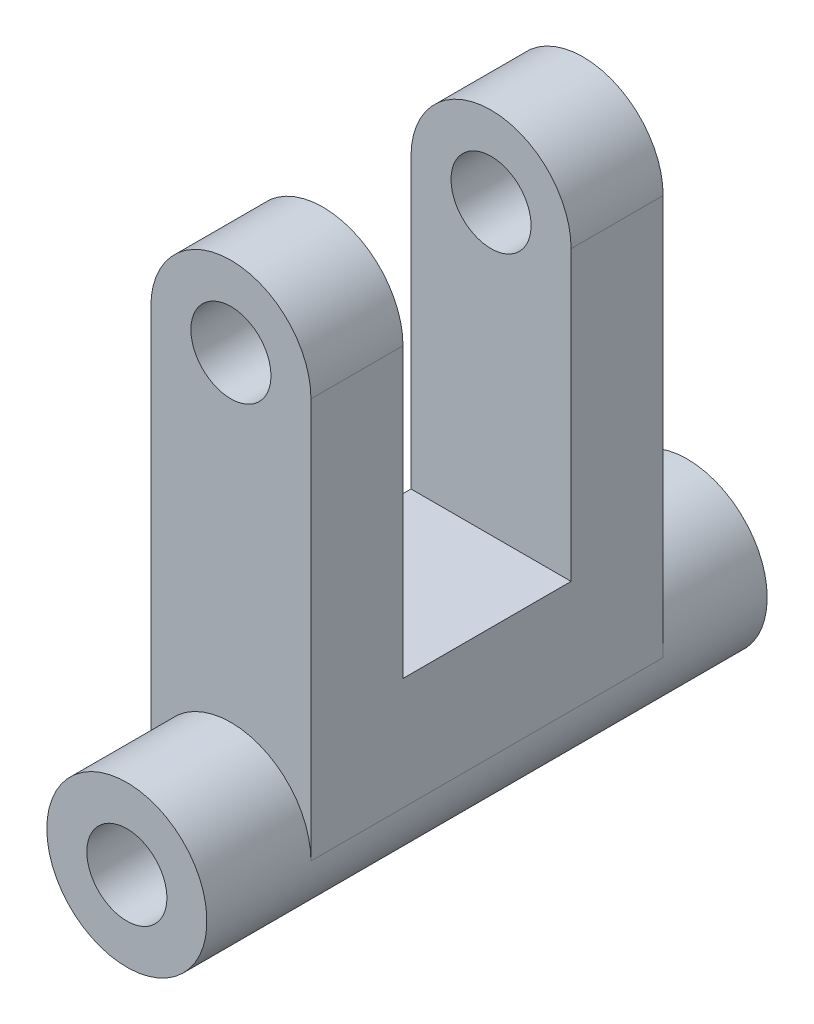
ISO-10303-21;
HEADER;
FILE_DESCRIPTION(('STEP AP214'),'2;1');
FILE_NAME('part.step','',(''),(''),'','','');
FILE_SCHEMA(('AUTOMOTIVE_DESIGN { 1 0 10303 214 1 1 1 1 }'));
ENDSEC;
DATA;
#1=APPLICATION_CONTEXT('core data for automotive mechanical design processes');
#2=APPLICATION_PROTOCOL_DEFINITION('international standard','automotive_design',2000,#1);
#3=PRODUCT_CONTEXT('',#1,'mechanical');
#4=PRODUCT('Part','Part','',(#3));
#5=PRODUCT_RELATED_PRODUCT_CATEGORY('part','',(#4));
#6=PRODUCT_DEFINITION_FORMATION('','',#4);
#7=PRODUCT_DEFINITION_CONTEXT('part definition',#1,'design');
#8=PRODUCT_DEFINITION('design','',#6,#7);
#9=PRODUCT_DEFINITION_SHAPE('','',#8);
#10=(LENGTH_UNIT() NAMED_UNIT(*) SI_UNIT(.MILLI.,.METRE.));
#11=(NAMED_UNIT(*) PLANE_ANGLE_UNIT() SI_UNIT($,.RADIAN.));
#12=(NAMED_UNIT(*) SI_UNIT($,.STERADIAN.) SOLID_ANGLE_UNIT());
#13=UNCERTAINTY_MEASURE_WITH_UNIT(LENGTH_MEASURE(1.E-05),#10,'distance_accuracy_value','');
#14=(GEOMETRIC_REPRESENTATION_CONTEXT(3) GLOBAL_UNCERTAINTY_ASSIGNED_CONTEXT((#13)) GLOBAL_UNIT_ASSIGNED_CONTEXT((#10,
#11,#12)) REPRESENTATION_CONTEXT('',''));
#15=CARTESIAN_POINT('',(0.,0.,0.));
#16=DIRECTION('',(0.,0.,1.));
#17=DIRECTION('',(1.,0.,0.));
#18=AXIS2_PLACEMENT_3D('',#15,#16,#17);
#19=CARTESIAN_POINT('',(0.,0.,5.75));
#20=DIRECTION('',(0.,0.,-1.));
#21=DIRECTION('',(-1.,0.,0.));
#22=AXIS2_PLACEMENT_3D('',#19,#20,#21);
#23=CYLINDRICAL_SURFACE('',#22,5.);
#24=CARTESIAN_POINT('',(0.,0.,-6.5));
#25=DIRECTION('',(0.,0.,1.));
#26=DIRECTION('',(1.,0.,0.));
#27=AXIS2_PLACEMENT_3D('',#24,#25,#26);
#28=CIRCLE('',#27,5.);
#29=CARTESIAN_POINT('',(5.,0.,-6.5));
#30=VERTEX_POINT('',#29);
#31=EDGE_CURVE('E185',#30,#30,#28,.T.);
#32=ORIENTED_EDGE('',*,*,#31,.T.);
#33=EDGE_LOOP('',(#32));
#34=FACE_BOUND('',#33,.T.);
#35=DIRECTION('',(0.,0.,-1.));
#36=VECTOR('',#35,1.);
#37=CARTESIAN_POINT('',(-5.,0.,5.75));
#38=LINE('',#37,#36);
#39=CARTESIAN_POINT('',(-5.,0.,22.));
#40=VERTEX_POINT('',#39);
#41=CARTESIAN_POINT('',(-5.,0.,0.));
#42=VERTEX_POINT('',#41);
#43=EDGE_CURVE('E168',#40,#42,#38,.T.);
#44=ORIENTED_EDGE('',*,*,#43,.T.);
#45=CARTESIAN_POINT('',(0.,0.,0.));
#46=DIRECTION('',(0.,0.,-1.));
#47=DIRECTION('',(-1.,0.,0.));
#48=AXIS2_PLACEMENT_3D('',#45,#46,#47);
#49=CIRCLE('',#48,5.);
#50=CARTESIAN_POINT('',(5.,0.,0.));
#51=VERTEX_POINT('',#50);
#52=EDGE_CURVE('E65',#42,#51,#49,.T.);
#53=ORIENTED_EDGE('',*,*,#52,.T.);
#54=DIRECTION('',(0.,0.,-1.));
#55=VECTOR('',#54,1.);
#56=CARTESIAN_POINT('',(5.,0.,5.75));
#57=LINE('',#56,#55);
#58=CARTESIAN_POINT('',(5.,0.,22.));
#59=VERTEX_POINT('',#58);
#60=EDGE_CURVE('E166',#59,#51,#57,.T.);
#61=ORIENTED_EDGE('',*,*,#60,.F.);
#62=CARTESIAN_POINT('',(0.,0.,22.));
#63=DIRECTION('',(0.,0.,1.));
#64=DIRECTION('',(1.,0.,0.));
#65=AXIS2_PLACEMENT_3D('',#62,#63,#64);
#66=CIRCLE('',#65,5.);
#67=EDGE_CURVE('E145',#59,#40,#66,.T.);
#68=ORIENTED_EDGE('',*,*,#67,.T.);
#69=EDGE_LOOP('',(#44,#53,#61,#68));
#70=FACE_BOUND('',#69,.T.);
#71=CARTESIAN_POINT('',(0.,0.,28.5));
#72=DIRECTION('',(0.,0.,-1.));
#73=DIRECTION('',(-1.,0.,0.));
#74=AXIS2_PLACEMENT_3D('',#71,#72,#73);
#75=CIRCLE('',#74,5.);
#76=CARTESIAN_POINT('',(-5.,0.,28.5));
#77=VERTEX_POINT('',#76);
#78=EDGE_CURVE('E177',#77,#77,#75,.T.);
#79=ORIENTED_EDGE('',*,*,#78,.T.);
#80=EDGE_LOOP('',(#79));
#81=FACE_BOUND('',#80,.T.);
#82=ADVANCED_FACE('F40',(#34,#70,#81),#23,.T.);
#83=CARTESIAN_POINT('',(5.,0.,5.75));
#84=DIRECTION('',(1.,0.,0.));
#85=DIRECTION('',(0.,1.,0.));
#86=AXIS2_PLACEMENT_3D('',#83,#84,#85);
#87=PLANE('',#86);
#88=DIRECTION('',(0.,0.,-1.));
#89=VECTOR('',#88,1.);
#90=CARTESIAN_POINT('',(5.,7.,5.75));
#91=LINE('',#90,#89);
#92=CARTESIAN_POINT('',(5.,7.,16.25));
#93=VERTEX_POINT('',#92);
#94=CARTESIAN_POINT('',(5.,7.,5.75));
#95=VERTEX_POINT('',#94);
#96=EDGE_CURVE('E116',#93,#95,#91,.T.);
#97=ORIENTED_EDGE('',*,*,#96,.F.);
#98=DIRECTION('',(0.,1.,0.));
#99=VECTOR('',#98,1.);
#100=CARTESIAN_POINT('',(5.,0.,16.25));
#101=LINE('',#100,#99);
#102=CARTESIAN_POINT('',(5.,25.,16.25));
#103=VERTEX_POINT('',#102);
#104=EDGE_CURVE('E141',#93,#103,#101,.T.);
#105=ORIENTED_EDGE('',*,*,#104,.T.);
#106=DIRECTION('',(0.,0.,-1.));
#107=VECTOR('',#106,1.);
#108=CARTESIAN_POINT('',(5.,25.,5.75));
#109=LINE('',#108,#107);
#110=CARTESIAN_POINT('',(5.,25.,22.));
#111=VERTEX_POINT('',#110);
#112=EDGE_CURVE('E123',#111,#103,#109,.T.);
#113=ORIENTED_EDGE('',*,*,#112,.F.);
#114=DIRECTION('',(0.,1.,0.));
#115=VECTOR('',#114,1.);
#116=CARTESIAN_POINT('',(5.,0.,22.));
#117=LINE('',#116,#115);
#118=EDGE_CURVE('E148',#59,#111,#117,.T.);
#119=ORIENTED_EDGE('',*,*,#118,.F.);
#120=ORIENTED_EDGE('',*,*,#60,.T.);
#121=DIRECTION('',(0.,-1.,0.));
#122=VECTOR('',#121,1.);
#123=CARTESIAN_POINT('',(5.,0.,0.));
#124=LINE('',#123,#122);
#125=CARTESIAN_POINT('',(5.,25.,0.));
#126=VERTEX_POINT('',#125);
#127=EDGE_CURVE('E157',#126,#51,#124,.T.);
#128=ORIENTED_EDGE('',*,*,#127,.F.);
#129=CARTESIAN_POINT('',(5.,25.,5.75));
#130=VERTEX_POINT('',#129);
#131=EDGE_CURVE('E173',#130,#126,#109,.T.);
#132=ORIENTED_EDGE('',*,*,#131,.F.);
#133=DIRECTION('',(0.,1.,0.));
#134=VECTOR('',#133,1.);
#135=CARTESIAN_POINT('',(5.,0.,5.75));
#136=LINE('',#135,#134);
#137=EDGE_CURVE('E136',#95,#130,#136,.T.);
#138=ORIENTED_EDGE('',*,*,#137,.F.);
#139=EDGE_LOOP('',(#97,#105,#113,#119,#120,#128,#132,#138));
#140=FACE_BOUND('',#139,.T.);
#141=ADVANCED_FACE('F42',(#140),#87,.T.);
#142=CARTESIAN_POINT('',(0.,25.,5.75));
#143=DIRECTION('',(0.,0.,-1.));
#144=DIRECTION('',(-1.,0.,0.));
#145=AXIS2_PLACEMENT_3D('',#142,#143,#144);
#146=CYLINDRICAL_SURFACE('',#145,5.);
#147=CARTESIAN_POINT('',(0.,25.,16.25));
#148=DIRECTION('',(0.,0.,-1.));
#149=DIRECTION('',(0.,1.,0.));
#150=AXIS2_PLACEMENT_3D('',#147,#148,#149);
#151=CIRCLE('',#150,5.);
#152=CARTESIAN_POINT('',(-5.,25.,16.25));
#153=VERTEX_POINT('',#152);
#154=EDGE_CURVE('E139',#153,#103,#151,.T.);
#155=ORIENTED_EDGE('',*,*,#154,.F.);
#156=DIRECTION('',(0.,0.,-1.));
#157=VECTOR('',#156,1.);
#158=CARTESIAN_POINT('',(-5.,25.,5.75));
#159=LINE('',#158,#157);
#160=CARTESIAN_POINT('',(-5.,25.,22.));
#161=VERTEX_POINT('',#160);
#162=EDGE_CURVE('E171',#161,#153,#159,.T.);
#163=ORIENTED_EDGE('',*,*,#162,.F.);
#164=CARTESIAN_POINT('',(0.,25.,22.));
#165=DIRECTION('',(0.,0.,1.));
#166=DIRECTION('',(1.,0.,0.));
#167=AXIS2_PLACEMENT_3D('',#164,#165,#166);
#168=CIRCLE('',#167,5.);
#169=EDGE_CURVE('E151',#111,#161,#168,.T.);
#170=ORIENTED_EDGE('',*,*,#169,.F.);
#171=ORIENTED_EDGE('',*,*,#112,.T.);
#172=EDGE_LOOP('',(#155,#163,#170,#171));
#173=FACE_BOUND('',#172,.T.);
#174=ADVANCED_FACE('F218',(#173),#146,.T.);
#175=CARTESIAN_POINT('',(0.,25.,5.75));
#176=DIRECTION('',(0.,0.,-1.));
#177=DIRECTION('',(0.,1.,0.));
#178=AXIS2_PLACEMENT_3D('',#175,#176,#177);
#179=CIRCLE('',#178,5.);
#180=CARTESIAN_POINT('',(-5.,25.,5.75));
#181=VERTEX_POINT('',#180);
#182=EDGE_CURVE('E57',#181,#130,#179,.T.);
#183=ORIENTED_EDGE('',*,*,#182,.T.);
#184=ORIENTED_EDGE('',*,*,#131,.T.);
#185=CARTESIAN_POINT('',(0.,25.,0.));
#186=DIRECTION('',(0.,0.,1.));
#187=DIRECTION('',(1.,0.,0.));
#188=AXIS2_PLACEMENT_3D('',#185,#186,#187);
#189=CIRCLE('',#188,5.);
#190=CARTESIAN_POINT('',(-5.,25.,0.));
#191=VERTEX_POINT('',#190);
#192=EDGE_CURVE('E160',#126,#191,#189,.T.);
#193=ORIENTED_EDGE('',*,*,#192,.T.);
#194=EDGE_CURVE('E170',#181,#191,#159,.T.);
#195=ORIENTED_EDGE('',*,*,#194,.F.);
#196=EDGE_LOOP('',(#183,#184,#193,#195));
#197=FACE_BOUND('',#196,.T.);
#198=ADVANCED_FACE('F225',(#197),#146,.T.);
#199=CARTESIAN_POINT('',(-5.,0.,5.75));
#200=DIRECTION('',(1.,0.,0.));
#201=DIRECTION('',(0.,1.,0.));
#202=AXIS2_PLACEMENT_3D('',#199,#200,#201);
#203=PLANE('',#202);
#204=DIRECTION('',(0.,1.,0.));
#205=VECTOR('',#204,1.);
#206=CARTESIAN_POINT('',(-5.,0.,16.25));
#207=LINE('',#206,#205);
#208=CARTESIAN_POINT('',(-5.,7.,16.25));
#209=VERTEX_POINT('',#208);
#210=EDGE_CURVE('E12',#209,#153,#207,.T.);
#211=ORIENTED_EDGE('',*,*,#210,.F.);
#212=DIRECTION('',(0.,0.,1.));
#213=VECTOR('',#212,1.);
#214=CARTESIAN_POINT('',(-5.,7.,0.));
#215=LINE('',#214,#213);
#216=CARTESIAN_POINT('',(-5.,7.,5.75));
#217=VERTEX_POINT('',#216);
#218=EDGE_CURVE('E113',#217,#209,#215,.T.);
#219=ORIENTED_EDGE('',*,*,#218,.F.);
#220=DIRECTION('',(0.,1.,0.));
#221=VECTOR('',#220,1.);
#222=CARTESIAN_POINT('',(-5.,0.,5.75));
#223=LINE('',#222,#221);
#224=EDGE_CURVE('E49',#217,#181,#223,.T.);
#225=ORIENTED_EDGE('',*,*,#224,.T.);
#226=ORIENTED_EDGE('',*,*,#194,.T.);
#227=DIRECTION('',(0.,-1.,0.));
#228=VECTOR('',#227,1.);
#229=CARTESIAN_POINT('',(-5.,0.,0.));
#230=LINE('',#229,#228);
#231=EDGE_CURVE('E163',#191,#42,#230,.T.);
#232=ORIENTED_EDGE('',*,*,#231,.T.);
#233=ORIENTED_EDGE('',*,*,#43,.F.);
#234=DIRECTION('',(0.,-1.,0.));
#235=VECTOR('',#234,1.);
#236=CARTESIAN_POINT('',(-5.,0.,22.));
#237=LINE('',#236,#235);
#238=EDGE_CURVE('E154',#161,#40,#237,.T.);
#239=ORIENTED_EDGE('',*,*,#238,.F.);
#240=ORIENTED_EDGE('',*,*,#162,.T.);
#241=EDGE_LOOP('',(#211,#219,#225,#226,#232,#233,#239,#240));
#242=FACE_BOUND('',#241,.T.);
#243=ADVANCED_FACE('F125',(#242),#203,.F.);
#244=CARTESIAN_POINT('',(0.,0.,0.));
#245=DIRECTION('',(0.,0.,1.));
#246=DIRECTION('',(1.,0.,0.));
#247=AXIS2_PLACEMENT_3D('',#244,#245,#246);
#248=PLANE('',#247);
#249=CARTESIAN_POINT('',(0.,25.,0.));
#250=DIRECTION('',(0.,0.,-1.));
#251=DIRECTION('',(-1.,0.,0.));
#252=AXIS2_PLACEMENT_3D('',#249,#250,#251);
#253=CIRCLE('',#252,2.5);
#254=CARTESIAN_POINT('',(-2.5,25.,0.));
#255=VERTEX_POINT('',#254);
#256=EDGE_CURVE('E189',#255,#255,#253,.T.);
#257=ORIENTED_EDGE('',*,*,#256,.F.);
#258=EDGE_LOOP('',(#257));
#259=FACE_BOUND('',#258,.T.);
#260=ORIENTED_EDGE('',*,*,#52,.F.);
#261=ORIENTED_EDGE('',*,*,#231,.F.);
#262=ORIENTED_EDGE('',*,*,#192,.F.);
#263=ORIENTED_EDGE('',*,*,#127,.T.);
#264=EDGE_LOOP('',(#260,#261,#262,#263));
#265=FACE_BOUND('',#264,.T.);
#266=ADVANCED_FACE('F222',(#259,#265),#248,.F.);
#267=CARTESIAN_POINT('',(0.,0.,22.));
#268=DIRECTION('',(0.,0.,1.));
#269=DIRECTION('',(1.,0.,0.));
#270=AXIS2_PLACEMENT_3D('',#267,#268,#269);
#271=PLANE('',#270);
#272=CARTESIAN_POINT('',(0.,25.,22.));
#273=DIRECTION('',(0.,0.,-1.));
#274=DIRECTION('',(-1.,0.,0.));
#275=AXIS2_PLACEMENT_3D('',#272,#273,#274);
#276=CIRCLE('',#275,2.5);
#277=CARTESIAN_POINT('',(-2.5,25.,22.));
#278=VERTEX_POINT('',#277);
#279=EDGE_CURVE('E190',#278,#278,#276,.T.);
#280=ORIENTED_EDGE('',*,*,#279,.T.);
#281=EDGE_LOOP('',(#280));
#282=FACE_BOUND('',#281,.T.);
#283=ORIENTED_EDGE('',*,*,#67,.F.);
#284=ORIENTED_EDGE('',*,*,#118,.T.);
#285=ORIENTED_EDGE('',*,*,#169,.T.);
#286=ORIENTED_EDGE('',*,*,#238,.T.);
#287=EDGE_LOOP('',(#283,#284,#285,#286));
#288=FACE_BOUND('',#287,.T.);
#289=ADVANCED_FACE('F238',(#282,#288),#271,.T.);
#290=CARTESIAN_POINT('',(15.,0.,16.25));
#291=DIRECTION('',(0.,0.,-1.));
#292=DIRECTION('',(0.,1.,0.));
#293=AXIS2_PLACEMENT_3D('',#290,#291,#292);
#294=PLANE('',#293);
#295=CARTESIAN_POINT('',(0.,25.,16.25));
#296=DIRECTION('',(0.,0.,-1.));
#297=DIRECTION('',(0.,1.,0.));
#298=AXIS2_PLACEMENT_3D('',#295,#296,#297);
#299=CIRCLE('',#298,2.5);
#300=CARTESIAN_POINT('',(0.,27.5,16.25));
#301=VERTEX_POINT('',#300);
#302=EDGE_CURVE('E127',#301,#301,#299,.T.);
#303=ORIENTED_EDGE('',*,*,#302,.F.);
#304=EDGE_LOOP('',(#303));
#305=FACE_BOUND('',#304,.T.);
#306=DIRECTION('',(-1.,0.,0.));
#307=VECTOR('',#306,1.);
#308=CARTESIAN_POINT('',(15.,7.,16.25));
#309=LINE('',#308,#307);
#310=EDGE_CURVE('E118',#93,#209,#309,.T.);
#311=ORIENTED_EDGE('',*,*,#310,.T.);
#312=ORIENTED_EDGE('',*,*,#210,.T.);
#313=ORIENTED_EDGE('',*,*,#154,.T.);
#314=ORIENTED_EDGE('',*,*,#104,.F.);
#315=EDGE_LOOP('',(#311,#312,#313,#314));
#316=FACE_BOUND('',#315,.T.);
#317=ADVANCED_FACE('F234',(#305,#316),#294,.T.);
#318=CARTESIAN_POINT('',(15.,0.,5.75));
#319=DIRECTION('',(0.,0.,-1.));
#320=DIRECTION('',(0.,1.,0.));
#321=AXIS2_PLACEMENT_3D('',#318,#319,#320);
#322=PLANE('',#321);
#323=CARTESIAN_POINT('',(0.,25.,5.75));
#324=DIRECTION('',(0.,0.,-1.));
#325=DIRECTION('',(0.,1.,0.));
#326=AXIS2_PLACEMENT_3D('',#323,#324,#325);
#327=CIRCLE('',#326,2.5);
#328=CARTESIAN_POINT('',(0.,27.5,5.75));
#329=VERTEX_POINT('',#328);
#330=EDGE_CURVE('E130',#329,#329,#327,.T.);
#331=ORIENTED_EDGE('',*,*,#330,.T.);
#332=EDGE_LOOP('',(#331));
#333=FACE_BOUND('',#332,.T.);
#334=ORIENTED_EDGE('',*,*,#137,.T.);
#335=ORIENTED_EDGE('',*,*,#182,.F.);
#336=ORIENTED_EDGE('',*,*,#224,.F.);
#337=DIRECTION('',(-1.,0.,0.));
#338=VECTOR('',#337,1.);
#339=CARTESIAN_POINT('',(15.,7.,5.75));
#340=LINE('',#339,#338);
#341=EDGE_CURVE('E109',#95,#217,#340,.T.);
#342=ORIENTED_EDGE('',*,*,#341,.F.);
#343=EDGE_LOOP('',(#334,#335,#336,#342));
#344=FACE_BOUND('',#343,.T.);
#345=ADVANCED_FACE('F120',(#333,#344),#322,.F.);
#346=CARTESIAN_POINT('',(15.,7.,0.));
#347=DIRECTION('',(0.,-1.,0.));
#348=DIRECTION('',(1.,0.,0.));
#349=AXIS2_PLACEMENT_3D('',#346,#347,#348);
#350=PLANE('',#349);
#351=ORIENTED_EDGE('',*,*,#96,.T.);
#352=ORIENTED_EDGE('',*,*,#341,.T.);
#353=ORIENTED_EDGE('',*,*,#218,.T.);
#354=ORIENTED_EDGE('',*,*,#310,.F.);
#355=EDGE_LOOP('',(#351,#352,#353,#354));
#356=FACE_BOUND('',#355,.T.);
#357=ADVANCED_FACE('F110',(#356),#350,.F.);
#358=CARTESIAN_POINT('',(0.,25.,22.));
#359=DIRECTION('',(0.,0.,-1.));
#360=DIRECTION('',(-1.,0.,0.));
#361=AXIS2_PLACEMENT_3D('',#358,#359,#360);
#362=CYLINDRICAL_SURFACE('',#361,2.5);
#363=ORIENTED_EDGE('',*,*,#256,.T.);
#364=EDGE_LOOP('',(#363));
#365=FACE_BOUND('',#364,.T.);
#366=ORIENTED_EDGE('',*,*,#330,.F.);
#367=EDGE_LOOP('',(#366));
#368=FACE_BOUND('',#367,.T.);
#369=ADVANCED_FACE('F198',(#365,#368),#362,.F.);
#370=ORIENTED_EDGE('',*,*,#302,.T.);
#371=EDGE_LOOP('',(#370));
#372=FACE_BOUND('',#371,.T.);
#373=ORIENTED_EDGE('',*,*,#279,.F.);
#374=EDGE_LOOP('',(#373));
#375=FACE_BOUND('',#374,.T.);
#376=ADVANCED_FACE('F200',(#372,#375),#362,.F.);
#377=CARTESIAN_POINT('',(-5.,5.,28.5));
#378=DIRECTION('',(0.,0.,-1.));
#379=DIRECTION('',(-1.,0.,0.));
#380=AXIS2_PLACEMENT_3D('',#377,#378,#379);
#381=PLANE('',#380);
#382=CARTESIAN_POINT('',(0.,0.,28.5));
#383=DIRECTION('',(0.,0.,-1.));
#384=DIRECTION('',(-1.,0.,0.));
#385=AXIS2_PLACEMENT_3D('',#382,#383,#384);
#386=CIRCLE('',#385,2.5);
#387=CARTESIAN_POINT('',(-2.5,0.,28.5));
#388=VERTEX_POINT('',#387);
#389=EDGE_CURVE('E175',#388,#388,#386,.F.);
#390=ORIENTED_EDGE('',*,*,#389,.F.);
#391=EDGE_LOOP('',(#390));
#392=FACE_BOUND('',#391,.T.);
#393=ORIENTED_EDGE('',*,*,#78,.F.);
#394=EDGE_LOOP('',(#393));
#395=FACE_BOUND('',#394,.T.);
#396=ADVANCED_FACE('F207',(#392,#395),#381,.F.);
#397=CARTESIAN_POINT('',(-5.,-5.,-6.5));
#398=DIRECTION('',(0.,0.,1.));
#399=DIRECTION('',(1.,0.,0.));
#400=AXIS2_PLACEMENT_3D('',#397,#398,#399);
#401=PLANE('',#400);
#402=CARTESIAN_POINT('',(0.,0.,-6.5));
#403=DIRECTION('',(0.,0.,1.));
#404=DIRECTION('',(1.,0.,0.));
#405=AXIS2_PLACEMENT_3D('',#402,#403,#404);
#406=CIRCLE('',#405,2.5);
#407=CARTESIAN_POINT('',(2.5,0.,-6.5));
#408=VERTEX_POINT('',#407);
#409=EDGE_CURVE('E44',#408,#408,#406,.F.);
#410=ORIENTED_EDGE('',*,*,#409,.F.);
#411=EDGE_LOOP('',(#410));
#412=FACE_BOUND('',#411,.T.);
#413=ORIENTED_EDGE('',*,*,#31,.F.);
#414=EDGE_LOOP('',(#413));
#415=FACE_BOUND('',#414,.T.);
#416=ADVANCED_FACE('F260',(#412,#415),#401,.F.);
#417=CARTESIAN_POINT('',(0.,0.,38.5));
#418=DIRECTION('',(0.,0.,-1.));
#419=DIRECTION('',(-1.,0.,0.));
#420=AXIS2_PLACEMENT_3D('',#417,#418,#419);
#421=CYLINDRICAL_SURFACE('',#420,2.5);
#422=ORIENTED_EDGE('',*,*,#409,.T.);
#423=EDGE_LOOP('',(#422));
#424=FACE_BOUND('',#423,.T.);
#425=ORIENTED_EDGE('',*,*,#389,.T.);
#426=EDGE_LOOP('',(#425));
#427=FACE_BOUND('',#426,.T.);
#428=ADVANCED_FACE('F258',(#424,#427),#421,.F.);
#429=CLOSED_SHELL('',(#82,#141,#174,#198,#243,#266,#289,#317,#345,#357,#369,#376,#396,#416,#428));
#430=MANIFOLD_SOLID_BREP('B2',#429);
#431=ADVANCED_BREP_SHAPE_REPRESENTATION('',(#18,#430),#14);
#432=SHAPE_DEFINITION_REPRESENTATION(#9,#431);
ENDSEC;
END-ISO-10303-21;
